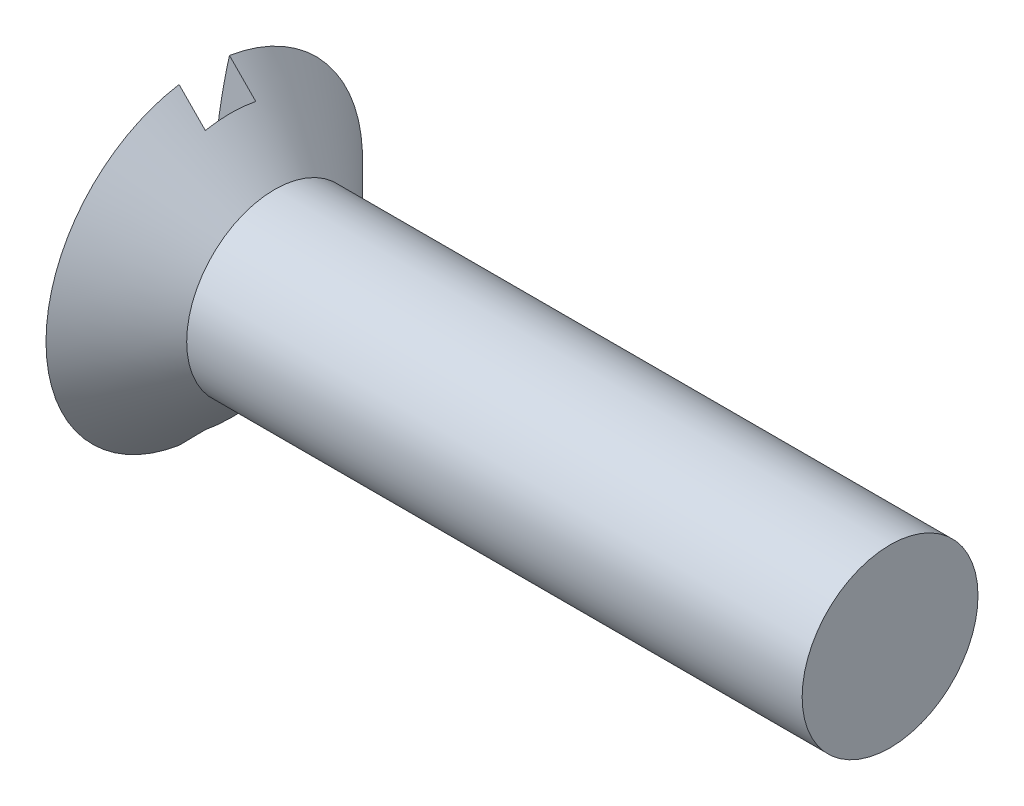
ISO-10303-21;
HEADER;
FILE_DESCRIPTION(('STEP AP214'),'2;1');
FILE_NAME('part.step','',(''),(''),'','','');
FILE_SCHEMA(('AUTOMOTIVE_DESIGN { 1 0 10303 214 1 1 1 1 }'));
ENDSEC;
DATA;
#1=APPLICATION_CONTEXT('core data for automotive mechanical design processes');
#2=APPLICATION_PROTOCOL_DEFINITION('international standard','automotive_design',2000,#1);
#3=PRODUCT_CONTEXT('',#1,'mechanical');
#4=PRODUCT('Part','Part','',(#3));
#5=PRODUCT_RELATED_PRODUCT_CATEGORY('part','',(#4));
#6=PRODUCT_DEFINITION_FORMATION('','',#4);
#7=PRODUCT_DEFINITION_CONTEXT('part definition',#1,'design');
#8=PRODUCT_DEFINITION('design','',#6,#7);
#9=PRODUCT_DEFINITION_SHAPE('','',#8);
#10=(LENGTH_UNIT() NAMED_UNIT(*) SI_UNIT(.MILLI.,.METRE.));
#11=(NAMED_UNIT(*) PLANE_ANGLE_UNIT() SI_UNIT($,.RADIAN.));
#12=(NAMED_UNIT(*) SI_UNIT($,.STERADIAN.) SOLID_ANGLE_UNIT());
#13=UNCERTAINTY_MEASURE_WITH_UNIT(LENGTH_MEASURE(1.E-05),#10,'distance_accuracy_value','');
#14=(GEOMETRIC_REPRESENTATION_CONTEXT(3) GLOBAL_UNCERTAINTY_ASSIGNED_CONTEXT((#13)) GLOBAL_UNIT_ASSIGNED_CONTEXT((#10,
#11,#12)) REPRESENTATION_CONTEXT('',''));
#15=CARTESIAN_POINT('',(0.,0.,0.));
#16=DIRECTION('',(0.,0.,1.));
#17=DIRECTION('',(1.,0.,0.));
#18=AXIS2_PLACEMENT_3D('',#15,#16,#17);
#19=CARTESIAN_POINT('',(13.0174999999999,0.,0.));
#20=DIRECTION('',(-1.,0.,0.));
#21=DIRECTION('',(0.,1.,0.));
#22=AXIS2_PLACEMENT_3D('',#19,#20,#21);
#23=SPHERICAL_SURFACE('',#22,13.0174999999999);
#24=CARTESIAN_POINT('',(0.317500000000003,0.,0.));
#25=DIRECTION('',(-1.,0.,0.));
#26=DIRECTION('',(0.,0.,1.));
#27=AXIS2_PLACEMENT_3D('',#24,#25,#26);
#28=CIRCLE('',#27,2.8575);
#29=CARTESIAN_POINT('',(0.317500000000001,-2.82110207247635,0.45463100055934));
#30=VERTEX_POINT('',#29);
#31=CARTESIAN_POINT('',(0.317500000000003,2.82110207247636,0.45463100055934));
#32=VERTEX_POINT('',#31);
#33=EDGE_CURVE('E128',#30,#32,#28,.T.);
#34=ORIENTED_EDGE('',*,*,#33,.T.);
#35=CARTESIAN_POINT('',(13.0174999999999,0.,0.45463100055934));
#36=DIRECTION('',(0.,0.,1.));
#37=DIRECTION('',(1.,0.,0.));
#38=AXIS2_PLACEMENT_3D('',#35,#36,#37);
#39=CIRCLE('',#38,13.0095586744258);
#40=EDGE_CURVE('E129',#32,#30,#39,.T.);
#41=ORIENTED_EDGE('',*,*,#40,.T.);
#42=EDGE_LOOP('',(#34,#41));
#43=FACE_BOUND('',#42,.T.);
#44=ADVANCED_FACE('F34',(#43),#23,.T.);
#45=CARTESIAN_POINT('',(0.317500000000001,2.82110207247636,-0.45463100055934));
#46=VERTEX_POINT('',#45);
#47=CARTESIAN_POINT('',(0.317500000000003,-2.82110207247636,-0.45463100055934));
#48=VERTEX_POINT('',#47);
#49=EDGE_CURVE('E130',#46,#48,#28,.T.);
#50=ORIENTED_EDGE('',*,*,#49,.T.);
#51=CARTESIAN_POINT('',(13.0174999999999,0.,-0.45463100055934));
#52=DIRECTION('',(0.,0.,-1.));
#53=DIRECTION('',(-1.,0.,0.));
#54=AXIS2_PLACEMENT_3D('',#51,#52,#53);
#55=CIRCLE('',#54,13.0095586744258);
#56=EDGE_CURVE('E55',#48,#46,#55,.T.);
#57=ORIENTED_EDGE('',*,*,#56,.T.);
#58=EDGE_LOOP('',(#50,#57));
#59=FACE_BOUND('',#58,.T.);
#60=ADVANCED_FACE('F36',(#59),#23,.T.);
#61=CARTESIAN_POINT('',(12.7,0.,0.));
#62=DIRECTION('',(-1.,0.,0.));
#63=DIRECTION('',(0.,0.,1.));
#64=AXIS2_PLACEMENT_3D('',#61,#62,#63);
#65=PLANE('',#64);
#66=CARTESIAN_POINT('',(12.7,0.,0.));
#67=DIRECTION('',(-1.,0.,0.));
#68=DIRECTION('',(0.,0.,1.));
#69=AXIS2_PLACEMENT_3D('',#66,#67,#68);
#70=CIRCLE('',#69,1.5875);
#71=CARTESIAN_POINT('',(12.7,0.,1.5875));
#72=VERTEX_POINT('',#71);
#73=EDGE_CURVE('E89',#72,#72,#70,.T.);
#74=ORIENTED_EDGE('',*,*,#73,.F.);
#75=EDGE_LOOP('',(#74));
#76=FACE_BOUND('',#75,.T.);
#77=ADVANCED_FACE('F125',(#76),#65,.F.);
#78=CARTESIAN_POINT('',(0.,0.,0.));
#79=DIRECTION('',(-1.,0.,0.));
#80=DIRECTION('',(0.,0.,1.));
#81=AXIS2_PLACEMENT_3D('',#78,#79,#80);
#82=CYLINDRICAL_SURFACE('',#81,1.5875);
#83=CARTESIAN_POINT('',(1.5875,0.,0.));
#84=DIRECTION('',(-1.,0.,0.));
#85=DIRECTION('',(0.,0.,1.));
#86=AXIS2_PLACEMENT_3D('',#83,#84,#85);
#87=CIRCLE('',#86,1.5875);
#88=CARTESIAN_POINT('',(1.5875,0.,1.5875));
#89=VERTEX_POINT('',#88);
#90=EDGE_CURVE('E132',#89,#89,#87,.T.);
#91=ORIENTED_EDGE('',*,*,#90,.F.);
#92=EDGE_LOOP('',(#91));
#93=FACE_BOUND('',#92,.T.);
#94=ORIENTED_EDGE('',*,*,#73,.T.);
#95=EDGE_LOOP('',(#94));
#96=FACE_BOUND('',#95,.T.);
#97=ADVANCED_FACE('F119',(#93,#96),#82,.T.);
#98=CARTESIAN_POINT('',(1.5875,0.,0.));
#99=DIRECTION('',(-1.,0.,0.));
#100=DIRECTION('',(0.,0.,1.));
#101=AXIS2_PLACEMENT_3D('',#98,#99,#100);
#102=CONICAL_SURFACE('',#101,1.5875,0.78539816339745);
#103=CARTESIAN_POINT('',(0.791975936823851,0.,0.));
#104=DIRECTION('',(1.,0.,0.));
#105=DIRECTION('',(0.,0.,-1.));
#106=AXIS2_PLACEMENT_3D('',#103,#104,#105);
#107=CIRCLE('',#106,2.38302406317615);
#108=CARTESIAN_POINT('',(0.791975936823851,2.33925508207356,-0.45463100055934));
#109=VERTEX_POINT('',#108);
#110=CARTESIAN_POINT('',(0.791975936823851,2.33925508207356,0.45463100055934));
#111=VERTEX_POINT('',#110);
#112=EDGE_CURVE('E48',#109,#111,#107,.T.);
#113=ORIENTED_EDGE('',*,*,#112,.T.);
#114=CARTESIAN_POINT('',(-3.1234974176439,-6.28206816051828,0.45463100055934));
#115=CARTESIAN_POINT('',(-2.90550134514049,-6.06349730623153,0.45463100055934));
#116=CARTESIAN_POINT('',(-2.68753057081909,-5.84490119919549,0.45463100055934));
#117=CARTESIAN_POINT('',(-2.25166632541104,-5.40761892638925,0.45463100055934));
#118=CARTESIAN_POINT('',(-2.03377285682609,-5.18893275812557,0.45463100055934));
#119=CARTESIAN_POINT('',(-1.59795169659775,-4.75129197136944,0.45463100055934));
#120=CARTESIAN_POINT('',(-1.38002408624005,-4.53233727191162,0.45463100055934));
#121=CARTESIAN_POINT('',(-0.944355181529721,-4.09425523586221,0.45463100055934));
#122=CARTESIAN_POINT('',(-0.726613881943959,-3.87512790447536,0.45463100055934));
#123=CARTESIAN_POINT('',(-0.293323922454635,-3.43850495624725,0.45463100055934));
#124=CARTESIAN_POINT('',(-0.0777727469586969,-3.22101183773238,0.45463100055934));
#125=CARTESIAN_POINT('',(0.245176766716886,-2.89437975740442,0.45463100055934));
#126=CARTESIAN_POINT('',(0.352768542467728,-2.78543210607733,0.45463100055934));
#127=CARTESIAN_POINT('',(0.567766271097444,-2.56735546901014,0.45463100055934));
#128=CARTESIAN_POINT('',(0.675172225617415,-2.45822648488835,0.45463100055934));
#129=CARTESIAN_POINT('',(0.88966858871113,-2.23975085041437,0.45463100055934));
#130=CARTESIAN_POINT('',(0.996759113265076,-2.13040431405281,0.45463100055934));
#131=CARTESIAN_POINT('',(1.21052333082848,-1.91129722880856,0.45463100055934));
#132=CARTESIAN_POINT('',(1.31719700952018,-1.80153666595506,0.45463100055934));
#133=CARTESIAN_POINT('',(1.52983738901324,-1.58136306815697,0.45463100055934));
#134=CARTESIAN_POINT('',(1.63580419771333,-1.47095013787935,0.45463100055934));
#135=CARTESIAN_POINT('',(1.79375909417775,-1.30439172866831,0.45463100055934));
#136=CARTESIAN_POINT('',(1.84624340357612,-1.24871730817488,0.45463100055934));
#137=CARTESIAN_POINT('',(1.95072258400257,-1.13691159881429,0.45463100055934));
#138=CARTESIAN_POINT('',(2.00271746496278,-1.08078031926161,0.45463100055934));
#139=CARTESIAN_POINT('',(2.08256298489889,-0.993420419461822,0.45463100055934));
#140=CARTESIAN_POINT('',(2.11067774717666,-0.962433381715702,0.45463100055934));
#141=CARTESIAN_POINT('',(2.16661231075676,-0.90019087455883,0.45463100055934));
#142=CARTESIAN_POINT('',(2.19443209699302,-0.86893539158327,0.45463100055934));
#143=CARTESIAN_POINT('',(2.2497474151407,-0.805995755563217,0.45463100055934));
#144=CARTESIAN_POINT('',(2.27724193189342,-0.774310708379156,0.45463100055934));
#145=CARTESIAN_POINT('',(2.33168086878893,-0.71047628908867,0.45463100055934));
#146=CARTESIAN_POINT('',(2.3586253568109,-0.678326975123893,0.45463100055934));
#147=CARTESIAN_POINT('',(2.40893351967394,-0.616804826600901,0.45463100055934));
#148=CARTESIAN_POINT('',(2.43237542601646,-0.587496227646852,0.45463100055934));
#149=CARTESIAN_POINT('',(2.47835645365839,-0.528180847547445,0.45463100055934));
#150=CARTESIAN_POINT('',(2.50089571435739,-0.498174175349031,0.45463100055934));
#151=CARTESIAN_POINT('',(2.54459793387316,-0.437229177158031,0.45463100055934));
#152=CARTESIAN_POINT('',(2.56576278683288,-0.406292223189896,0.45463100055934));
#153=CARTESIAN_POINT('',(2.6059674192792,-0.343082392802473,0.45463100055934));
#154=CARTESIAN_POINT('',(2.62500959762588,-0.31081108210194,0.45463100055934));
#155=CARTESIAN_POINT('',(2.65731600166315,-0.24881873695639,0.45463100055934));
#156=CARTESIAN_POINT('',(2.67101175946206,-0.219328532748185,0.45463100055934));
#157=CARTESIAN_POINT('',(2.69424834002835,-0.158765805129996,0.45463100055934));
#158=CARTESIAN_POINT('',(2.70380186124154,-0.127698448528323,0.45463100055934));
#159=CARTESIAN_POINT('',(2.71575528563443,-0.0697794662810617,0.45463100055934));
#160=CARTESIAN_POINT('',(2.71911054607594,-0.043134675085885,0.45463100055934));
#161=CARTESIAN_POINT('',(2.72103477818475,0.0102995063767686,0.45463100055934));
#162=CARTESIAN_POINT('',(2.71961017918548,0.0370886540549645,0.45463100055934));
#163=CARTESIAN_POINT('',(2.71137958928204,0.096573345556254,0.45463100055934));
#164=CARTESIAN_POINT('',(2.70333014327564,0.129091563893965,0.45463100055934));
#165=CARTESIAN_POINT('',(2.6875069196452,0.1766023429528,0.45463100055934));
#166=CARTESIAN_POINT('',(2.6815836431327,0.192274351610916,0.45463100055934));
#167=CARTESIAN_POINT('',(2.66872830683706,0.223199849137963,0.45463100055934));
#168=CARTESIAN_POINT('',(2.66179642175445,0.238453409943303,0.45463100055934));
#169=CARTESIAN_POINT('',(2.64277930182376,0.277509096110928,0.45463100055934));
#170=CARTESIAN_POINT('',(2.63007835226395,0.301008441371955,0.45463100055934));
#171=CARTESIAN_POINT('',(2.60326429205845,0.347193888539001,0.45463100055934));
#172=CARTESIAN_POINT('',(2.58915013740892,0.369879372148975,0.45463100055934));
#173=CARTESIAN_POINT('',(2.54527374788733,0.437072395460726,0.45463100055934));
#174=CARTESIAN_POINT('',(2.51403541487777,0.480608338668999,0.45463100055934));
#175=CARTESIAN_POINT('',(2.44928129345659,0.56635536753373,0.45463100055934));
#176=CARTESIAN_POINT('',(2.41575179695295,0.608555774351355,0.45463100055934));
#177=CARTESIAN_POINT('',(2.34748524895041,0.691851581573589,0.45463100055934));
#178=CARTESIAN_POINT('',(2.31275022832951,0.732948651505467,0.45463100055934));
#179=CARTESIAN_POINT('',(2.24304359129134,0.81379586965417,0.45463100055934));
#180=CARTESIAN_POINT('',(2.20808466938334,0.853557048158763,0.45463100055934));
#181=CARTESIAN_POINT('',(2.1376353585226,0.932606667727283,0.45463100055934));
#182=CARTESIAN_POINT('',(2.10214495523003,0.971895095984225,0.45463100055934));
#183=CARTESIAN_POINT('',(1.99510934445345,1.08926374764718,0.45463100055934));
#184=CARTESIAN_POINT('',(1.9230090727246,1.16683670241637,0.45463100055934));
#185=CARTESIAN_POINT('',(1.77792948167321,1.32128892317582,0.45463100055934));
#186=CARTESIAN_POINT('',(1.70494939893323,1.3981674676285,0.45463100055934));
#187=CARTESIAN_POINT('',(1.55848482369813,1.55143096473138,0.45463100055934));
#188=CARTESIAN_POINT('',(1.48500037014319,1.62781595462201,0.45463100055934));
#189=CARTESIAN_POINT('',(1.26507136310307,1.85544749162511,0.45463100055934));
#190=CARTESIAN_POINT('',(1.1181460542755,2.0062288596454,0.45463100055934));
#191=CARTESIAN_POINT('',(0.823719293725561,2.30711018924594,0.45463100055934));
#192=CARTESIAN_POINT('',(0.676218091106324,2.4572103953199,0.45463100055934));
#193=CARTESIAN_POINT('',(0.377792810913322,2.7601398431008,0.45463100055934));
#194=CARTESIAN_POINT('',(0.226860956765978,2.91296142293586,0.45463100055934));
#195=CARTESIAN_POINT('',(-0.0752434972331506,3.21836704088566,0.45463100055934));
#196=CARTESIAN_POINT('',(-0.226416097707345,3.37095107838427,0.45463100055934));
#197=CARTESIAN_POINT('',(-0.680217887788783,3.82852013905993,0.45463100055934));
#198=CARTESIAN_POINT('',(-0.983081848601881,4.13327228028455,0.45463100055934));
#199=CARTESIAN_POINT('',(-1.59212435912449,4.74549723551388,0.45463100055934));
#200=CARTESIAN_POINT('',(-1.89830595753235,5.05296701414237,0.45463100055934));
#201=CARTESIAN_POINT('',(-2.51081128122347,5.66766013196414,0.45463100055934));
#202=CARTESIAN_POINT('',(-2.81713497321172,5.97488350432973,0.45463100055934));
#203=CARTESIAN_POINT('',(-3.1234974176439,6.28206816051828,0.45463100055934));
#204=B_SPLINE_CURVE_WITH_KNOTS('',3,(#114,#115,#116,#117,#118,#119,#120,#121,#122,#123,#124,
#125,#126,#127,#128,#129,#130,#131,#132,#133,#134,#135,#136,#137,#138,#139,#140,#141,#142,#143,
#144,#145,#146,#147,#148,#149,#150,#151,#152,#153,#154,#155,#156,#157,#158,#159,#160,#161,#162,
#163,#164,#165,#166,#167,#168,#169,#170,#171,#172,#173,#174,#175,#176,#177,#178,#179,#180,#181,
#182,#183,#184,#185,#186,#187,#188,#189,#190,#191,#192,#193,#194,#195,#196,#197,#198,#199,#200,
#201,#202,#203),.UNSPECIFIED.,.F.,.F.,(4,2,2,2,2,2,2,2,2,2,2,2,2,2,2,2,2,2,2,2,2,2,2,2,2,2,2,2,
2,2,2,2,2,2,2,2,2,2,2,2,2,2,2,2,4),(0.,0.92609912518649,1.85222589439442,2.77899571027292,
3.70573857916431,4.62437291392752,5.08373125130491,5.54308551089351,6.00224192941196,
6.46141398273171,6.92051426467372,7.15005171940549,7.37958450597538,7.50510495829509,
7.63063179105021,7.75648071133896,7.88231400552773,7.99489313572059,8.10745481223795,
8.21985791675912,8.33213267703657,8.42949035407958,8.52654742396646,8.60671985529465,
8.68678449087181,8.786645027839,8.8368849266069,8.8871161336858,8.96717744560617,
9.04729834534782,9.20790655591244,9.3695780219955,9.53098922127084,9.68981582917709,
9.84864673011343,10.1663509802036,10.4843542229334,10.8023331842318,11.4339127958589,
12.0652442090238,12.7096144991183,13.3539864578413,14.6429404904762,15.9446944566015,
17.2462256210294),.UNSPECIFIED.);
#205=EDGE_CURVE('E11',#111,#32,#204,.T.);
#206=ORIENTED_EDGE('',*,*,#205,.T.);
#207=ORIENTED_EDGE('',*,*,#33,.F.);
#208=CARTESIAN_POINT('',(0.791975936823851,-2.33925508207356,0.45463100055934));
#209=VERTEX_POINT('',#208);
#210=EDGE_CURVE('E38',#30,#209,#204,.T.);
#211=ORIENTED_EDGE('',*,*,#210,.T.);
#212=CARTESIAN_POINT('',(0.791975936823851,-2.33925508207356,-0.45463100055934));
#213=VERTEX_POINT('',#212);
#214=EDGE_CURVE('E88',#209,#213,#107,.T.);
#215=ORIENTED_EDGE('',*,*,#214,.T.);
#216=CARTESIAN_POINT('',(-3.1234974176439,6.28206816051828,-0.45463100055934));
#217=CARTESIAN_POINT('',(-2.90550134514049,6.06349730623153,-0.45463100055934));
#218=CARTESIAN_POINT('',(-2.6875305708191,5.8449011991955,-0.45463100055934));
#219=CARTESIAN_POINT('',(-2.25166632541104,5.40761892638925,-0.45463100055934));
#220=CARTESIAN_POINT('',(-2.03377285682609,5.18893275812557,-0.45463100055934));
#221=CARTESIAN_POINT('',(-1.59795169659775,4.75129197136945,-0.45463100055934));
#222=CARTESIAN_POINT('',(-1.38002408624006,4.53233727191163,-0.45463100055934));
#223=CARTESIAN_POINT('',(-0.944355181529726,4.09425523586221,-0.45463100055934));
#224=CARTESIAN_POINT('',(-0.726613881943965,3.87512790447537,-0.45463100055934));
#225=CARTESIAN_POINT('',(-0.293323922454641,3.43850495624726,-0.45463100055934));
#226=CARTESIAN_POINT('',(-0.0777727469587027,3.22101183773238,-0.45463100055934));
#227=CARTESIAN_POINT('',(0.245176766716881,2.89437975740443,-0.45463100055934));
#228=CARTESIAN_POINT('',(0.352768542467723,2.78543210607734,-0.45463100055934));
#229=CARTESIAN_POINT('',(0.56776627109744,2.56735546901014,-0.45463100055934));
#230=CARTESIAN_POINT('',(0.675172225617412,2.45822648488836,-0.45463100055934));
#231=CARTESIAN_POINT('',(0.889668588711127,2.23975085041437,-0.45463100055934));
#232=CARTESIAN_POINT('',(0.996759113265074,2.13040431405281,-0.45463100055934));
#233=CARTESIAN_POINT('',(1.21052333082848,1.91129722880857,-0.45463100055934));
#234=CARTESIAN_POINT('',(1.31719700952017,1.80153666595506,-0.45463100055934));
#235=CARTESIAN_POINT('',(1.52983738901323,1.58136306815697,-0.45463100055934));
#236=CARTESIAN_POINT('',(1.63580419771333,1.47095013787935,-0.45463100055934));
#237=CARTESIAN_POINT('',(1.79375909417774,1.30439172866831,-0.45463100055934));
#238=CARTESIAN_POINT('',(1.84624340357612,1.24871730817488,-0.45463100055934));
#239=CARTESIAN_POINT('',(1.95072258400257,1.13691159881429,-0.45463100055934));
#240=CARTESIAN_POINT('',(2.00271746496278,1.08078031926161,-0.45463100055934));
#241=CARTESIAN_POINT('',(2.08256298489889,0.993420419461823,-0.45463100055934));
#242=CARTESIAN_POINT('',(2.11067774717666,0.962433381715703,-0.45463100055934));
#243=CARTESIAN_POINT('',(2.16661231075676,0.900190874558831,-0.45463100055934));
#244=CARTESIAN_POINT('',(2.19443209699302,0.86893539158327,-0.45463100055934));
#245=CARTESIAN_POINT('',(2.2497474151407,0.805995755563217,-0.45463100055934));
#246=CARTESIAN_POINT('',(2.27724193189342,0.774310708379157,-0.45463100055934));
#247=CARTESIAN_POINT('',(2.33168086878893,0.710476289088671,-0.45463100055934));
#248=CARTESIAN_POINT('',(2.3586253568109,0.678326975123894,-0.45463100055934));
#249=CARTESIAN_POINT('',(2.40893351967394,0.616804826600901,-0.45463100055934));
#250=CARTESIAN_POINT('',(2.43237542601646,0.587496227646853,-0.45463100055934));
#251=CARTESIAN_POINT('',(2.47835645365839,0.528180847547445,-0.45463100055934));
#252=CARTESIAN_POINT('',(2.50089571435739,0.498174175349031,-0.45463100055934));
#253=CARTESIAN_POINT('',(2.54459793387316,0.437229177158031,-0.45463100055934));
#254=CARTESIAN_POINT('',(2.56576278683288,0.406292223189895,-0.45463100055934));
#255=CARTESIAN_POINT('',(2.6059674192792,0.343082392802472,-0.45463100055934));
#256=CARTESIAN_POINT('',(2.62500959762588,0.31081108210194,-0.45463100055934));
#257=CARTESIAN_POINT('',(2.65731600166315,0.248818736956391,-0.45463100055934));
#258=CARTESIAN_POINT('',(2.67101175946206,0.219328532748185,-0.45463100055934));
#259=CARTESIAN_POINT('',(2.69424834002835,0.158765805129997,-0.45463100055934));
#260=CARTESIAN_POINT('',(2.70380186124154,0.127698448528324,-0.45463100055934));
#261=CARTESIAN_POINT('',(2.71575528563443,0.0697794662810621,-0.45463100055934));
#262=CARTESIAN_POINT('',(2.71911054607594,0.0431346750858854,-0.45463100055934));
#263=CARTESIAN_POINT('',(2.72103477818475,-0.0102995063767682,-0.45463100055934));
#264=CARTESIAN_POINT('',(2.71961017918548,-0.0370886540549641,-0.45463100055934));
#265=CARTESIAN_POINT('',(2.71137958928204,-0.0965733455562533,-0.45463100055934));
#266=CARTESIAN_POINT('',(2.70333014327564,-0.129091563893964,-0.45463100055934));
#267=CARTESIAN_POINT('',(2.6875069196452,-0.176602342952799,-0.45463100055934));
#268=CARTESIAN_POINT('',(2.6815836431327,-0.192274351610915,-0.45463100055934));
#269=CARTESIAN_POINT('',(2.66872830683706,-0.223199849137962,-0.45463100055934));
#270=CARTESIAN_POINT('',(2.66179642175445,-0.238453409943303,-0.45463100055934));
#271=CARTESIAN_POINT('',(2.64277930182376,-0.277509096110927,-0.45463100055934));
#272=CARTESIAN_POINT('',(2.63007835226395,-0.301008441371954,-0.45463100055934));
#273=CARTESIAN_POINT('',(2.60326429205845,-0.347193888538999,-0.45463100055934));
#274=CARTESIAN_POINT('',(2.58915013740892,-0.369879372148973,-0.45463100055934));
#275=CARTESIAN_POINT('',(2.54527374788733,-0.437072395460725,-0.45463100055934));
#276=CARTESIAN_POINT('',(2.51403541487777,-0.480608338668998,-0.45463100055934));
#277=CARTESIAN_POINT('',(2.44928129345659,-0.566355367533728,-0.45463100055934));
#278=CARTESIAN_POINT('',(2.41575179695295,-0.608555774351354,-0.45463100055934));
#279=CARTESIAN_POINT('',(2.34748524895041,-0.691851581573587,-0.45463100055934));
#280=CARTESIAN_POINT('',(2.31275022832951,-0.732948651505465,-0.45463100055934));
#281=CARTESIAN_POINT('',(2.24304359129134,-0.813795869654167,-0.45463100055934));
#282=CARTESIAN_POINT('',(2.20808466938334,-0.85355704815876,-0.45463100055934));
#283=CARTESIAN_POINT('',(2.1376353585226,-0.932606667727279,-0.45463100055934));
#284=CARTESIAN_POINT('',(2.10214495523003,-0.971895095984222,-0.45463100055934));
#285=CARTESIAN_POINT('',(1.99510934445345,-1.08926374764717,-0.45463100055934));
#286=CARTESIAN_POINT('',(1.9230090727246,-1.16683670241636,-0.45463100055934));
#287=CARTESIAN_POINT('',(1.77792948167321,-1.32128892317581,-0.45463100055934));
#288=CARTESIAN_POINT('',(1.70494939893323,-1.39816746762849,-0.45463100055934));
#289=CARTESIAN_POINT('',(1.55848482369814,-1.55143096473137,-0.45463100055934));
#290=CARTESIAN_POINT('',(1.48500037014319,-1.62781595462201,-0.45463100055934));
#291=CARTESIAN_POINT('',(1.26507136310308,-1.8554474916251,-0.45463100055934));
#292=CARTESIAN_POINT('',(1.11814605427551,-2.00622885964539,-0.45463100055934));
#293=CARTESIAN_POINT('',(0.823719293725569,-2.30711018924593,-0.45463100055934));
#294=CARTESIAN_POINT('',(0.676218091106332,-2.45721039531989,-0.45463100055934));
#295=CARTESIAN_POINT('',(0.377792810913331,-2.76013984310079,-0.45463100055934));
#296=CARTESIAN_POINT('',(0.226860956765987,-2.91296142293585,-0.45463100055934));
#297=CARTESIAN_POINT('',(-0.0752434972331418,-3.21836704088566,-0.45463100055934));
#298=CARTESIAN_POINT('',(-0.226416097707337,-3.37095107838426,-0.45463100055934));
#299=CARTESIAN_POINT('',(-0.680217887788777,-3.82852013905992,-0.45463100055934));
#300=CARTESIAN_POINT('',(-0.983081848601875,-4.13327228028454,-0.45463100055934));
#301=CARTESIAN_POINT('',(-1.59212435912449,-4.74549723551388,-0.45463100055934));
#302=CARTESIAN_POINT('',(-1.89830595753234,-5.05296701414237,-0.45463100055934));
#303=CARTESIAN_POINT('',(-2.51081128122347,-5.66766013196414,-0.45463100055934));
#304=CARTESIAN_POINT('',(-2.81713497321171,-5.97488350432973,-0.45463100055934));
#305=CARTESIAN_POINT('',(-3.1234974176439,-6.28206816051828,-0.45463100055934));
#306=B_SPLINE_CURVE_WITH_KNOTS('',3,(#216,#217,#218,#219,#220,#221,#222,#223,#224,#225,#226,
#227,#228,#229,#230,#231,#232,#233,#234,#235,#236,#237,#238,#239,#240,#241,#242,#243,#244,#245,
#246,#247,#248,#249,#250,#251,#252,#253,#254,#255,#256,#257,#258,#259,#260,#261,#262,#263,#264,
#265,#266,#267,#268,#269,#270,#271,#272,#273,#274,#275,#276,#277,#278,#279,#280,#281,#282,#283,
#284,#285,#286,#287,#288,#289,#290,#291,#292,#293,#294,#295,#296,#297,#298,#299,#300,#301,#302,
#303,#304,#305),.UNSPECIFIED.,.F.,.F.,(4,2,2,2,2,2,2,2,2,2,2,2,2,2,2,2,2,2,2,2,2,2,2,2,2,2,2,2,
2,2,2,2,2,2,2,2,2,2,2,2,2,2,2,2,4),(0.,0.926099125186488,1.85222589439442,2.77899571027292,
3.7057385791643,4.62437291392752,5.0837312513049,5.5430855108935,6.00224192941196,
6.46141398273171,6.92051426467372,7.15005171940549,7.37958450597538,7.50510495829509,
7.63063179105021,7.75648071133896,7.88231400552773,7.99489313572059,8.10745481223795,
8.21985791675912,8.33213267703656,8.42949035407958,8.52654742396646,8.60671985529465,
8.6867844908718,8.786645027839,8.83688492660689,8.88711613368579,8.96717744560617,
9.04729834534781,9.20790655591244,9.3695780219955,9.53098922127083,9.68981582917708,
9.84864673011343,10.1663509802036,10.4843542229334,10.8023331842318,11.4339127958589,
12.0652442090237,12.7096144991183,13.3539864578413,14.6429404904762,15.9446944566015,
17.2462256210294),.UNSPECIFIED.);
#307=EDGE_CURVE('E79',#213,#48,#306,.T.);
#308=ORIENTED_EDGE('',*,*,#307,.T.);
#309=ORIENTED_EDGE('',*,*,#49,.F.);
#310=EDGE_CURVE('E91',#46,#109,#306,.T.);
#311=ORIENTED_EDGE('',*,*,#310,.T.);
#312=EDGE_LOOP('',(#113,#206,#207,#211,#215,#308,#309,#311));
#313=FACE_BOUND('',#312,.T.);
#314=ORIENTED_EDGE('',*,*,#90,.T.);
#315=EDGE_LOOP('',(#314));
#316=FACE_BOUND('',#315,.T.);
#317=ADVANCED_FACE('F98',(#313,#316),#102,.T.);
#318=CARTESIAN_POINT('',(0.791975936823851,-4.064,-0.45463100055934));
#319=DIRECTION('',(1.,0.,0.));
#320=DIRECTION('',(0.,0.,-1.));
#321=AXIS2_PLACEMENT_3D('',#318,#319,#320);
#322=PLANE('',#321);
#323=DIRECTION('',(0.,1.,0.));
#324=VECTOR('',#323,1.);
#325=CARTESIAN_POINT('',(0.791975936823851,-4.064,-0.45463100055934));
#326=LINE('',#325,#324);
#327=EDGE_CURVE('E82',#213,#109,#326,.T.);
#328=ORIENTED_EDGE('',*,*,#327,.F.);
#329=ORIENTED_EDGE('',*,*,#214,.F.);
#330=DIRECTION('',(0.,1.,0.));
#331=VECTOR('',#330,1.);
#332=CARTESIAN_POINT('',(0.791975936823851,-4.064,0.45463100055934));
#333=LINE('',#332,#331);
#334=EDGE_CURVE('E96',#209,#111,#333,.T.);
#335=ORIENTED_EDGE('',*,*,#334,.T.);
#336=ORIENTED_EDGE('',*,*,#112,.F.);
#337=EDGE_LOOP('',(#328,#329,#335,#336));
#338=FACE_BOUND('',#337,.T.);
#339=ADVANCED_FACE('F93',(#338),#322,.F.);
#340=CARTESIAN_POINT('',(-0.791975936823851,-4.064,0.45463100055934));
#341=DIRECTION('',(0.,0.,1.));
#342=DIRECTION('',(1.,0.,0.));
#343=AXIS2_PLACEMENT_3D('',#340,#341,#342);
#344=PLANE('',#343);
#345=ORIENTED_EDGE('',*,*,#40,.F.);
#346=ORIENTED_EDGE('',*,*,#205,.F.);
#347=ORIENTED_EDGE('',*,*,#334,.F.);
#348=ORIENTED_EDGE('',*,*,#210,.F.);
#349=EDGE_LOOP('',(#345,#346,#347,#348));
#350=FACE_BOUND('',#349,.T.);
#351=ADVANCED_FACE('F112',(#350),#344,.F.);
#352=CARTESIAN_POINT('',(-0.791975936823851,-4.064,-0.45463100055934));
#353=DIRECTION('',(0.,0.,-1.));
#354=DIRECTION('',(-1.,0.,0.));
#355=AXIS2_PLACEMENT_3D('',#352,#353,#354);
#356=PLANE('',#355);
#357=ORIENTED_EDGE('',*,*,#56,.F.);
#358=ORIENTED_EDGE('',*,*,#307,.F.);
#359=ORIENTED_EDGE('',*,*,#327,.T.);
#360=ORIENTED_EDGE('',*,*,#310,.F.);
#361=EDGE_LOOP('',(#357,#358,#359,#360));
#362=FACE_BOUND('',#361,.T.);
#363=ADVANCED_FACE('F81',(#362),#356,.F.);
#364=CLOSED_SHELL('',(#44,#60,#77,#97,#317,#339,#351,#363));
#365=MANIFOLD_SOLID_BREP('B2',#364);
#366=ADVANCED_BREP_SHAPE_REPRESENTATION('',(#18,#365),#14);
#367=SHAPE_DEFINITION_REPRESENTATION(#9,#366);
ENDSEC;
END-ISO-10303-21;
